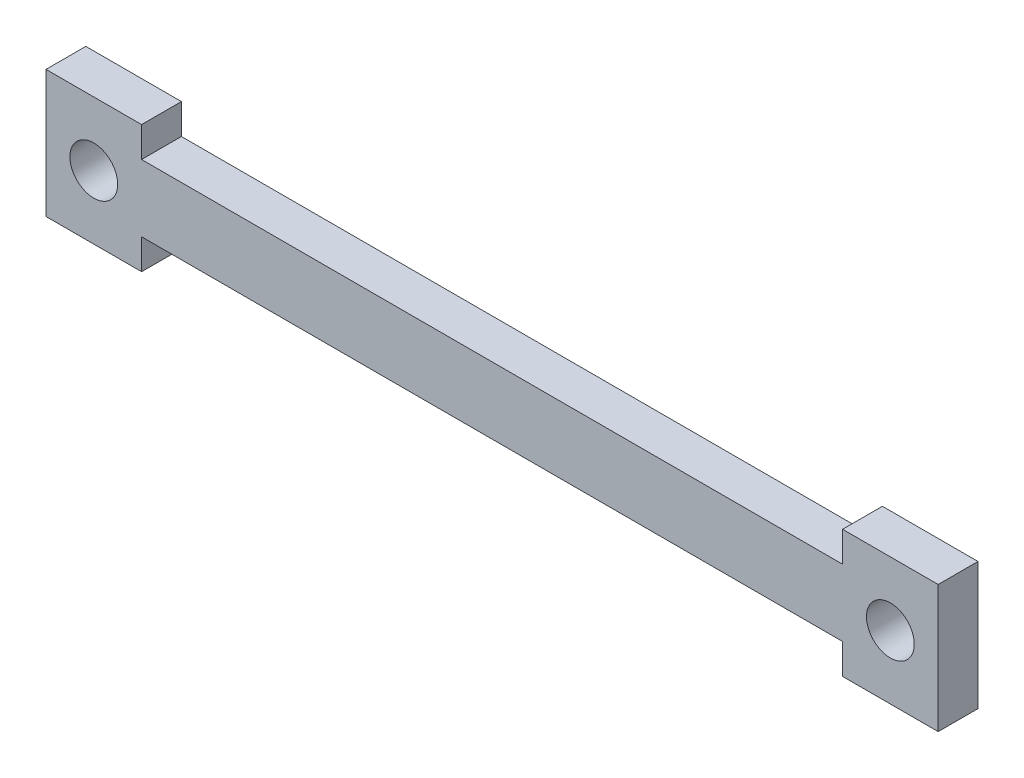
ISO-10303-21;
HEADER;
FILE_DESCRIPTION(('STEP AP214'),'2;1');
FILE_NAME('part.step','',(''),(''),'','','');
FILE_SCHEMA(('AUTOMOTIVE_DESIGN { 1 0 10303 214 1 1 1 1 }'));
ENDSEC;
DATA;
#1=APPLICATION_CONTEXT('core data for automotive mechanical design processes');
#2=APPLICATION_PROTOCOL_DEFINITION('international standard','automotive_design',2000,#1);
#3=PRODUCT_CONTEXT('',#1,'mechanical');
#4=PRODUCT('Part','Part','',(#3));
#5=PRODUCT_RELATED_PRODUCT_CATEGORY('part','',(#4));
#6=PRODUCT_DEFINITION_FORMATION('','',#4);
#7=PRODUCT_DEFINITION_CONTEXT('part definition',#1,'design');
#8=PRODUCT_DEFINITION('design','',#6,#7);
#9=PRODUCT_DEFINITION_SHAPE('','',#8);
#10=(LENGTH_UNIT() NAMED_UNIT(*) SI_UNIT(.MILLI.,.METRE.));
#11=(NAMED_UNIT(*) PLANE_ANGLE_UNIT() SI_UNIT($,.RADIAN.));
#12=(NAMED_UNIT(*) SI_UNIT($,.STERADIAN.) SOLID_ANGLE_UNIT());
#13=UNCERTAINTY_MEASURE_WITH_UNIT(LENGTH_MEASURE(1.E-05),#10,'distance_accuracy_value','');
#14=(GEOMETRIC_REPRESENTATION_CONTEXT(3) GLOBAL_UNCERTAINTY_ASSIGNED_CONTEXT((#13)) GLOBAL_UNIT_ASSIGNED_CONTEXT((#10,
#11,#12)) REPRESENTATION_CONTEXT('',''));
#15=CARTESIAN_POINT('',(0.,0.,0.));
#16=DIRECTION('',(0.,0.,1.));
#17=DIRECTION('',(1.,0.,0.));
#18=AXIS2_PLACEMENT_3D('',#15,#16,#17);
#19=CARTESIAN_POINT('',(22.,-4.,2.5));
#20=DIRECTION('',(0.,1.,0.));
#21=DIRECTION('',(0.,0.,1.));
#22=AXIS2_PLACEMENT_3D('',#19,#20,#21);
#23=PLANE('',#22);
#24=DIRECTION('',(1.,0.,0.));
#25=VECTOR('',#24,1.);
#26=CARTESIAN_POINT('',(22.,-4.,0.));
#27=LINE('',#26,#25);
#28=CARTESIAN_POINT('',(22.,-4.,0.));
#29=VERTEX_POINT('',#28);
#30=CARTESIAN_POINT('',(28.,-4.,0.));
#31=VERTEX_POINT('',#30);
#32=EDGE_CURVE('E157',#29,#31,#27,.T.);
#33=ORIENTED_EDGE('',*,*,#32,.T.);
#34=DIRECTION('',(0.,0.,-1.));
#35=VECTOR('',#34,1.);
#36=CARTESIAN_POINT('',(28.,-4.,2.5));
#37=LINE('',#36,#35);
#38=CARTESIAN_POINT('',(28.,-4.,2.5));
#39=VERTEX_POINT('',#38);
#40=EDGE_CURVE('E11',#39,#31,#37,.T.);
#41=ORIENTED_EDGE('',*,*,#40,.F.);
#42=DIRECTION('',(1.,0.,0.));
#43=VECTOR('',#42,1.);
#44=CARTESIAN_POINT('',(22.,-4.,2.5));
#45=LINE('',#44,#43);
#46=CARTESIAN_POINT('',(22.,-4.,2.5));
#47=VERTEX_POINT('',#46);
#48=EDGE_CURVE('E180',#47,#39,#45,.T.);
#49=ORIENTED_EDGE('',*,*,#48,.F.);
#50=DIRECTION('',(0.,0.,-1.));
#51=VECTOR('',#50,1.);
#52=CARTESIAN_POINT('',(22.,-4.,2.5));
#53=LINE('',#52,#51);
#54=EDGE_CURVE('E153',#47,#29,#53,.T.);
#55=ORIENTED_EDGE('',*,*,#54,.T.);
#56=EDGE_LOOP('',(#33,#41,#49,#55));
#57=FACE_BOUND('',#56,.T.);
#58=ADVANCED_FACE('F37',(#57),#23,.F.);
#59=CARTESIAN_POINT('',(28.,4.,2.5));
#60=DIRECTION('',(-1.,0.,0.));
#61=DIRECTION('',(0.,0.,1.));
#62=AXIS2_PLACEMENT_3D('',#59,#60,#61);
#63=PLANE('',#62);
#64=DIRECTION('',(0.,1.,0.));
#65=VECTOR('',#64,1.);
#66=CARTESIAN_POINT('',(28.,4.,0.));
#67=LINE('',#66,#65);
#68=CARTESIAN_POINT('',(28.,4.,0.));
#69=VERTEX_POINT('',#68);
#70=EDGE_CURVE('E160',#31,#69,#67,.T.);
#71=ORIENTED_EDGE('',*,*,#70,.T.);
#72=DIRECTION('',(0.,0.,-1.));
#73=VECTOR('',#72,1.);
#74=CARTESIAN_POINT('',(28.,4.,2.5));
#75=LINE('',#74,#73);
#76=CARTESIAN_POINT('',(28.,4.,2.5));
#77=VERTEX_POINT('',#76);
#78=EDGE_CURVE('E45',#77,#69,#75,.T.);
#79=ORIENTED_EDGE('',*,*,#78,.F.);
#80=DIRECTION('',(0.,1.,0.));
#81=VECTOR('',#80,1.);
#82=CARTESIAN_POINT('',(28.,4.,2.5));
#83=LINE('',#82,#81);
#84=EDGE_CURVE('E108',#39,#77,#83,.T.);
#85=ORIENTED_EDGE('',*,*,#84,.F.);
#86=ORIENTED_EDGE('',*,*,#40,.T.);
#87=EDGE_LOOP('',(#71,#79,#85,#86));
#88=FACE_BOUND('',#87,.T.);
#89=ADVANCED_FACE('F259',(#88),#63,.F.);
#90=CARTESIAN_POINT('',(22.,4.,2.5));
#91=DIRECTION('',(0.,-1.,0.));
#92=DIRECTION('',(0.,0.,-1.));
#93=AXIS2_PLACEMENT_3D('',#90,#91,#92);
#94=PLANE('',#93);
#95=DIRECTION('',(-1.,0.,0.));
#96=VECTOR('',#95,1.);
#97=CARTESIAN_POINT('',(22.,4.,0.));
#98=LINE('',#97,#96);
#99=CARTESIAN_POINT('',(22.,4.,0.));
#100=VERTEX_POINT('',#99);
#101=EDGE_CURVE('E163',#69,#100,#98,.T.);
#102=ORIENTED_EDGE('',*,*,#101,.T.);
#103=DIRECTION('',(0.,0.,-1.));
#104=VECTOR('',#103,1.);
#105=CARTESIAN_POINT('',(22.,4.,2.5));
#106=LINE('',#105,#104);
#107=CARTESIAN_POINT('',(22.,4.,2.5));
#108=VERTEX_POINT('',#107);
#109=EDGE_CURVE('E199',#108,#100,#106,.T.);
#110=ORIENTED_EDGE('',*,*,#109,.F.);
#111=DIRECTION('',(-1.,0.,0.));
#112=VECTOR('',#111,1.);
#113=CARTESIAN_POINT('',(22.,4.,2.5));
#114=LINE('',#113,#112);
#115=EDGE_CURVE('E207',#77,#108,#114,.T.);
#116=ORIENTED_EDGE('',*,*,#115,.F.);
#117=ORIENTED_EDGE('',*,*,#78,.T.);
#118=EDGE_LOOP('',(#102,#110,#116,#117));
#119=FACE_BOUND('',#118,.T.);
#120=ADVANCED_FACE('F205',(#119),#94,.F.);
#121=CARTESIAN_POINT('',(22.,4.,2.5));
#122=DIRECTION('',(1.,0.,0.));
#123=DIRECTION('',(0.,0.,-1.));
#124=AXIS2_PLACEMENT_3D('',#121,#122,#123);
#125=PLANE('',#124);
#126=DIRECTION('',(0.,-1.,0.));
#127=VECTOR('',#126,1.);
#128=CARTESIAN_POINT('',(22.,4.,0.));
#129=LINE('',#128,#127);
#130=CARTESIAN_POINT('',(22.,2.1,0.));
#131=VERTEX_POINT('',#130);
#132=EDGE_CURVE('E165',#100,#131,#129,.T.);
#133=ORIENTED_EDGE('',*,*,#132,.T.);
#134=DIRECTION('',(0.,0.,-1.));
#135=VECTOR('',#134,1.);
#136=CARTESIAN_POINT('',(22.,2.1,2.5));
#137=LINE('',#136,#135);
#138=CARTESIAN_POINT('',(22.,2.1,2.5));
#139=VERTEX_POINT('',#138);
#140=EDGE_CURVE('E196',#139,#131,#137,.T.);
#141=ORIENTED_EDGE('',*,*,#140,.F.);
#142=DIRECTION('',(0.,-1.,0.));
#143=VECTOR('',#142,1.);
#144=CARTESIAN_POINT('',(22.,4.,2.5));
#145=LINE('',#144,#143);
#146=EDGE_CURVE('E225',#108,#139,#145,.T.);
#147=ORIENTED_EDGE('',*,*,#146,.F.);
#148=ORIENTED_EDGE('',*,*,#109,.T.);
#149=EDGE_LOOP('',(#133,#141,#147,#148));
#150=FACE_BOUND('',#149,.T.);
#151=ADVANCED_FACE('F216',(#150),#125,.F.);
#152=CARTESIAN_POINT('',(-22.,2.1,2.5));
#153=DIRECTION('',(0.,-1.,0.));
#154=DIRECTION('',(0.,0.,-1.));
#155=AXIS2_PLACEMENT_3D('',#152,#153,#154);
#156=PLANE('',#155);
#157=DIRECTION('',(-1.,0.,0.));
#158=VECTOR('',#157,1.);
#159=CARTESIAN_POINT('',(-22.,2.1,0.));
#160=LINE('',#159,#158);
#161=CARTESIAN_POINT('',(-22.,2.1,0.));
#162=VERTEX_POINT('',#161);
#163=EDGE_CURVE('E167',#131,#162,#160,.T.);
#164=ORIENTED_EDGE('',*,*,#163,.T.);
#165=DIRECTION('',(0.,0.,-1.));
#166=VECTOR('',#165,1.);
#167=CARTESIAN_POINT('',(-22.,2.1,2.5));
#168=LINE('',#167,#166);
#169=CARTESIAN_POINT('',(-22.,2.1,2.5));
#170=VERTEX_POINT('',#169);
#171=EDGE_CURVE('E193',#170,#162,#168,.T.);
#172=ORIENTED_EDGE('',*,*,#171,.F.);
#173=DIRECTION('',(-1.,0.,0.));
#174=VECTOR('',#173,1.);
#175=CARTESIAN_POINT('',(-22.,2.1,2.5));
#176=LINE('',#175,#174);
#177=EDGE_CURVE('E222',#139,#170,#176,.T.);
#178=ORIENTED_EDGE('',*,*,#177,.F.);
#179=ORIENTED_EDGE('',*,*,#140,.T.);
#180=EDGE_LOOP('',(#164,#172,#178,#179));
#181=FACE_BOUND('',#180,.T.);
#182=ADVANCED_FACE('F220',(#181),#156,.F.);
#183=CARTESIAN_POINT('',(-22.,4.,2.5));
#184=DIRECTION('',(-1.,0.,0.));
#185=DIRECTION('',(0.,0.,1.));
#186=AXIS2_PLACEMENT_3D('',#183,#184,#185);
#187=PLANE('',#186);
#188=DIRECTION('',(0.,1.,0.));
#189=VECTOR('',#188,1.);
#190=CARTESIAN_POINT('',(-22.,4.,0.));
#191=LINE('',#190,#189);
#192=CARTESIAN_POINT('',(-22.,4.,0.));
#193=VERTEX_POINT('',#192);
#194=EDGE_CURVE('E169',#162,#193,#191,.T.);
#195=ORIENTED_EDGE('',*,*,#194,.T.);
#196=DIRECTION('',(0.,0.,-1.));
#197=VECTOR('',#196,1.);
#198=CARTESIAN_POINT('',(-22.,4.,2.5));
#199=LINE('',#198,#197);
#200=CARTESIAN_POINT('',(-22.,4.,2.5));
#201=VERTEX_POINT('',#200);
#202=EDGE_CURVE('E190',#201,#193,#199,.T.);
#203=ORIENTED_EDGE('',*,*,#202,.F.);
#204=DIRECTION('',(0.,1.,0.));
#205=VECTOR('',#204,1.);
#206=CARTESIAN_POINT('',(-22.,4.,2.5));
#207=LINE('',#206,#205);
#208=EDGE_CURVE('E224',#170,#201,#207,.T.);
#209=ORIENTED_EDGE('',*,*,#208,.F.);
#210=ORIENTED_EDGE('',*,*,#171,.T.);
#211=EDGE_LOOP('',(#195,#203,#209,#210));
#212=FACE_BOUND('',#211,.T.);
#213=ADVANCED_FACE('F272',(#212),#187,.F.);
#214=CARTESIAN_POINT('',(-28.,4.,2.5));
#215=DIRECTION('',(0.,-1.,0.));
#216=DIRECTION('',(0.,0.,-1.));
#217=AXIS2_PLACEMENT_3D('',#214,#215,#216);
#218=PLANE('',#217);
#219=DIRECTION('',(-1.,0.,0.));
#220=VECTOR('',#219,1.);
#221=CARTESIAN_POINT('',(-28.,4.,0.));
#222=LINE('',#221,#220);
#223=CARTESIAN_POINT('',(-28.,4.,0.));
#224=VERTEX_POINT('',#223);
#225=EDGE_CURVE('E171',#193,#224,#222,.T.);
#226=ORIENTED_EDGE('',*,*,#225,.T.);
#227=DIRECTION('',(0.,0.,-1.));
#228=VECTOR('',#227,1.);
#229=CARTESIAN_POINT('',(-28.,4.,2.5));
#230=LINE('',#229,#228);
#231=CARTESIAN_POINT('',(-28.,4.,2.5));
#232=VERTEX_POINT('',#231);
#233=EDGE_CURVE('E187',#232,#224,#230,.T.);
#234=ORIENTED_EDGE('',*,*,#233,.F.);
#235=DIRECTION('',(-1.,0.,0.));
#236=VECTOR('',#235,1.);
#237=CARTESIAN_POINT('',(-28.,4.,2.5));
#238=LINE('',#237,#236);
#239=EDGE_CURVE('E227',#201,#232,#238,.T.);
#240=ORIENTED_EDGE('',*,*,#239,.F.);
#241=ORIENTED_EDGE('',*,*,#202,.T.);
#242=EDGE_LOOP('',(#226,#234,#240,#241));
#243=FACE_BOUND('',#242,.T.);
#244=ADVANCED_FACE('F275',(#243),#218,.F.);
#245=CARTESIAN_POINT('',(-28.,4.,2.5));
#246=DIRECTION('',(1.,0.,0.));
#247=DIRECTION('',(0.,1.,0.));
#248=AXIS2_PLACEMENT_3D('',#245,#246,#247);
#249=PLANE('',#248);
#250=DIRECTION('',(0.,-1.,0.));
#251=VECTOR('',#250,1.);
#252=CARTESIAN_POINT('',(-28.,4.,0.));
#253=LINE('',#252,#251);
#254=CARTESIAN_POINT('',(-28.,-4.,0.));
#255=VERTEX_POINT('',#254);
#256=EDGE_CURVE('E173',#224,#255,#253,.T.);
#257=ORIENTED_EDGE('',*,*,#256,.T.);
#258=DIRECTION('',(0.,0.,-1.));
#259=VECTOR('',#258,1.);
#260=CARTESIAN_POINT('',(-28.,-4.,2.5));
#261=LINE('',#260,#259);
#262=CARTESIAN_POINT('',(-28.,-4.,2.5));
#263=VERTEX_POINT('',#262);
#264=EDGE_CURVE('E184',#263,#255,#261,.T.);
#265=ORIENTED_EDGE('',*,*,#264,.F.);
#266=DIRECTION('',(0.,-1.,0.));
#267=VECTOR('',#266,1.);
#268=CARTESIAN_POINT('',(-28.,4.,2.5));
#269=LINE('',#268,#267);
#270=EDGE_CURVE('E233',#232,#263,#269,.T.);
#271=ORIENTED_EDGE('',*,*,#270,.F.);
#272=ORIENTED_EDGE('',*,*,#233,.T.);
#273=EDGE_LOOP('',(#257,#265,#271,#272));
#274=FACE_BOUND('',#273,.T.);
#275=ADVANCED_FACE('F239',(#274),#249,.F.);
#276=CARTESIAN_POINT('',(-28.,-4.,2.5));
#277=DIRECTION('',(0.,1.,0.));
#278=DIRECTION('',(0.,0.,1.));
#279=AXIS2_PLACEMENT_3D('',#276,#277,#278);
#280=PLANE('',#279);
#281=DIRECTION('',(1.,0.,0.));
#282=VECTOR('',#281,1.);
#283=CARTESIAN_POINT('',(-28.,-4.,0.));
#284=LINE('',#283,#282);
#285=CARTESIAN_POINT('',(-22.,-4.,0.));
#286=VERTEX_POINT('',#285);
#287=EDGE_CURVE('E175',#255,#286,#284,.T.);
#288=ORIENTED_EDGE('',*,*,#287,.T.);
#289=DIRECTION('',(0.,0.,-1.));
#290=VECTOR('',#289,1.);
#291=CARTESIAN_POINT('',(-22.,-4.,2.5));
#292=LINE('',#291,#290);
#293=CARTESIAN_POINT('',(-22.,-4.,2.5));
#294=VERTEX_POINT('',#293);
#295=EDGE_CURVE('E148',#294,#286,#292,.T.);
#296=ORIENTED_EDGE('',*,*,#295,.F.);
#297=DIRECTION('',(1.,0.,0.));
#298=VECTOR('',#297,1.);
#299=CARTESIAN_POINT('',(-28.,-4.,2.5));
#300=LINE('',#299,#298);
#301=EDGE_CURVE('E139',#263,#294,#300,.T.);
#302=ORIENTED_EDGE('',*,*,#301,.F.);
#303=ORIENTED_EDGE('',*,*,#264,.T.);
#304=EDGE_LOOP('',(#288,#296,#302,#303));
#305=FACE_BOUND('',#304,.T.);
#306=ADVANCED_FACE('F243',(#305),#280,.F.);
#307=CARTESIAN_POINT('',(-22.,-2.1,2.5));
#308=DIRECTION('',(-1.,0.,0.));
#309=DIRECTION('',(0.,0.,1.));
#310=AXIS2_PLACEMENT_3D('',#307,#308,#309);
#311=PLANE('',#310);
#312=DIRECTION('',(0.,1.,0.));
#313=VECTOR('',#312,1.);
#314=CARTESIAN_POINT('',(-22.,-2.1,0.));
#315=LINE('',#314,#313);
#316=CARTESIAN_POINT('',(-22.,-2.1,0.));
#317=VERTEX_POINT('',#316);
#318=EDGE_CURVE('E147',#286,#317,#315,.T.);
#319=ORIENTED_EDGE('',*,*,#318,.T.);
#320=DIRECTION('',(0.,0.,-1.));
#321=VECTOR('',#320,1.);
#322=CARTESIAN_POINT('',(-22.,-2.1,2.5));
#323=LINE('',#322,#321);
#324=CARTESIAN_POINT('',(-22.,-2.1,2.5));
#325=VERTEX_POINT('',#324);
#326=EDGE_CURVE('E144',#325,#317,#323,.T.);
#327=ORIENTED_EDGE('',*,*,#326,.F.);
#328=DIRECTION('',(0.,1.,0.));
#329=VECTOR('',#328,1.);
#330=CARTESIAN_POINT('',(-22.,-2.1,2.5));
#331=LINE('',#330,#329);
#332=EDGE_CURVE('E133',#294,#325,#331,.T.);
#333=ORIENTED_EDGE('',*,*,#332,.F.);
#334=ORIENTED_EDGE('',*,*,#295,.T.);
#335=EDGE_LOOP('',(#319,#327,#333,#334));
#336=FACE_BOUND('',#335,.T.);
#337=ADVANCED_FACE('F145',(#336),#311,.F.);
#338=CARTESIAN_POINT('',(-22.,-2.1,2.5));
#339=DIRECTION('',(0.,1.,0.));
#340=DIRECTION('',(0.,0.,1.));
#341=AXIS2_PLACEMENT_3D('',#338,#339,#340);
#342=PLANE('',#341);
#343=DIRECTION('',(1.,0.,0.));
#344=VECTOR('',#343,1.);
#345=CARTESIAN_POINT('',(-22.,-2.1,0.));
#346=LINE('',#345,#344);
#347=CARTESIAN_POINT('',(22.,-2.1,0.));
#348=VERTEX_POINT('',#347);
#349=EDGE_CURVE('E94',#317,#348,#346,.T.);
#350=ORIENTED_EDGE('',*,*,#349,.T.);
#351=DIRECTION('',(0.,0.,-1.));
#352=VECTOR('',#351,1.);
#353=CARTESIAN_POINT('',(22.,-2.1,2.5));
#354=LINE('',#353,#352);
#355=CARTESIAN_POINT('',(22.,-2.1,2.5));
#356=VERTEX_POINT('',#355);
#357=EDGE_CURVE('E149',#356,#348,#354,.T.);
#358=ORIENTED_EDGE('',*,*,#357,.F.);
#359=DIRECTION('',(1.,0.,0.));
#360=VECTOR('',#359,1.);
#361=CARTESIAN_POINT('',(-22.,-2.1,2.5));
#362=LINE('',#361,#360);
#363=EDGE_CURVE('E137',#325,#356,#362,.T.);
#364=ORIENTED_EDGE('',*,*,#363,.F.);
#365=ORIENTED_EDGE('',*,*,#326,.T.);
#366=EDGE_LOOP('',(#350,#358,#364,#365));
#367=FACE_BOUND('',#366,.T.);
#368=ADVANCED_FACE('F151',(#367),#342,.F.);
#369=CARTESIAN_POINT('',(22.,-2.1,2.5));
#370=DIRECTION('',(1.,0.,0.));
#371=DIRECTION('',(0.,1.,0.));
#372=AXIS2_PLACEMENT_3D('',#369,#370,#371);
#373=PLANE('',#372);
#374=DIRECTION('',(0.,-1.,0.));
#375=VECTOR('',#374,1.);
#376=CARTESIAN_POINT('',(22.,-2.1,0.));
#377=LINE('',#376,#375);
#378=EDGE_CURVE('E100',#348,#29,#377,.T.);
#379=ORIENTED_EDGE('',*,*,#378,.T.);
#380=ORIENTED_EDGE('',*,*,#54,.F.);
#381=DIRECTION('',(0.,-1.,0.));
#382=VECTOR('',#381,1.);
#383=CARTESIAN_POINT('',(22.,-2.1,2.5));
#384=LINE('',#383,#382);
#385=EDGE_CURVE('E53',#356,#47,#384,.T.);
#386=ORIENTED_EDGE('',*,*,#385,.F.);
#387=ORIENTED_EDGE('',*,*,#357,.T.);
#388=EDGE_LOOP('',(#379,#380,#386,#387));
#389=FACE_BOUND('',#388,.T.);
#390=ADVANCED_FACE('F247',(#389),#373,.F.);
#391=CARTESIAN_POINT('',(0.,0.,2.5));
#392=DIRECTION('',(0.,0.,-1.));
#393=DIRECTION('',(-1.,0.,0.));
#394=AXIS2_PLACEMENT_3D('',#391,#392,#393);
#395=PLANE('',#394);
#396=CARTESIAN_POINT('',(-25.,0.,2.5));
#397=DIRECTION('',(0.,0.,1.));
#398=DIRECTION('',(1.,0.,0.));
#399=AXIS2_PLACEMENT_3D('',#396,#397,#398);
#400=CIRCLE('',#399,1.5);
#401=CARTESIAN_POINT('',(-23.5,0.,2.5));
#402=VERTEX_POINT('',#401);
#403=EDGE_CURVE('E340',#402,#402,#400,.T.);
#404=ORIENTED_EDGE('',*,*,#403,.F.);
#405=EDGE_LOOP('',(#404));
#406=FACE_BOUND('',#405,.T.);
#407=CARTESIAN_POINT('',(25.,0.,2.5));
#408=DIRECTION('',(0.,0.,1.));
#409=DIRECTION('',(-1.,0.,0.));
#410=AXIS2_PLACEMENT_3D('',#407,#408,#409);
#411=CIRCLE('',#410,1.5);
#412=CARTESIAN_POINT('',(23.5,0.,2.5));
#413=VERTEX_POINT('',#412);
#414=EDGE_CURVE('E345',#413,#413,#411,.T.);
#415=ORIENTED_EDGE('',*,*,#414,.F.);
#416=EDGE_LOOP('',(#415));
#417=FACE_BOUND('',#416,.T.);
#418=ORIENTED_EDGE('',*,*,#48,.T.);
#419=ORIENTED_EDGE('',*,*,#84,.T.);
#420=ORIENTED_EDGE('',*,*,#115,.T.);
#421=ORIENTED_EDGE('',*,*,#146,.T.);
#422=ORIENTED_EDGE('',*,*,#177,.T.);
#423=ORIENTED_EDGE('',*,*,#208,.T.);
#424=ORIENTED_EDGE('',*,*,#239,.T.);
#425=ORIENTED_EDGE('',*,*,#270,.T.);
#426=ORIENTED_EDGE('',*,*,#301,.T.);
#427=ORIENTED_EDGE('',*,*,#332,.T.);
#428=ORIENTED_EDGE('',*,*,#363,.T.);
#429=ORIENTED_EDGE('',*,*,#385,.T.);
#430=EDGE_LOOP('',(#418,#419,#420,#421,#422,#423,#424,#425,#426,#427,#428,#429));
#431=FACE_BOUND('',#430,.T.);
#432=ADVANCED_FACE('F135',(#406,#417,#431),#395,.F.);
#433=CARTESIAN_POINT('',(0.,0.,0.));
#434=DIRECTION('',(0.,0.,-1.));
#435=DIRECTION('',(-1.,0.,0.));
#436=AXIS2_PLACEMENT_3D('',#433,#434,#435);
#437=PLANE('',#436);
#438=CARTESIAN_POINT('',(-25.,0.,0.));
#439=DIRECTION('',(0.,0.,1.));
#440=DIRECTION('',(1.,0.,0.));
#441=AXIS2_PLACEMENT_3D('',#438,#439,#440);
#442=CIRCLE('',#441,1.5);
#443=CARTESIAN_POINT('',(-23.5,0.,0.));
#444=VERTEX_POINT('',#443);
#445=EDGE_CURVE('E161',#444,#444,#442,.T.);
#446=ORIENTED_EDGE('',*,*,#445,.T.);
#447=EDGE_LOOP('',(#446));
#448=FACE_BOUND('',#447,.T.);
#449=CARTESIAN_POINT('',(25.,0.,0.));
#450=DIRECTION('',(0.,0.,1.));
#451=DIRECTION('',(-1.,0.,0.));
#452=AXIS2_PLACEMENT_3D('',#449,#450,#451);
#453=CIRCLE('',#452,1.5);
#454=CARTESIAN_POINT('',(23.5,0.,0.));
#455=VERTEX_POINT('',#454);
#456=EDGE_CURVE('E341',#455,#455,#453,.T.);
#457=ORIENTED_EDGE('',*,*,#456,.T.);
#458=EDGE_LOOP('',(#457));
#459=FACE_BOUND('',#458,.T.);
#460=ORIENTED_EDGE('',*,*,#32,.F.);
#461=ORIENTED_EDGE('',*,*,#378,.F.);
#462=ORIENTED_EDGE('',*,*,#349,.F.);
#463=ORIENTED_EDGE('',*,*,#318,.F.);
#464=ORIENTED_EDGE('',*,*,#287,.F.);
#465=ORIENTED_EDGE('',*,*,#256,.F.);
#466=ORIENTED_EDGE('',*,*,#225,.F.);
#467=ORIENTED_EDGE('',*,*,#194,.F.);
#468=ORIENTED_EDGE('',*,*,#163,.F.);
#469=ORIENTED_EDGE('',*,*,#132,.F.);
#470=ORIENTED_EDGE('',*,*,#101,.F.);
#471=ORIENTED_EDGE('',*,*,#70,.F.);
#472=EDGE_LOOP('',(#460,#461,#462,#463,#464,#465,#466,#467,#468,#469,#470,#471));
#473=FACE_BOUND('',#472,.T.);
#474=ADVANCED_FACE('F211',(#448,#459,#473),#437,.T.);
#475=CARTESIAN_POINT('',(25.,0.,0.));
#476=DIRECTION('',(0.,0.,1.));
#477=DIRECTION('',(1.,0.,0.));
#478=AXIS2_PLACEMENT_3D('',#475,#476,#477);
#479=CYLINDRICAL_SURFACE('',#478,1.5);
#480=ORIENTED_EDGE('',*,*,#456,.F.);
#481=EDGE_LOOP('',(#480));
#482=FACE_BOUND('',#481,.T.);
#483=ORIENTED_EDGE('',*,*,#414,.T.);
#484=EDGE_LOOP('',(#483));
#485=FACE_BOUND('',#484,.T.);
#486=ADVANCED_FACE('F312',(#482,#485),#479,.F.);
#487=CARTESIAN_POINT('',(-25.,0.,0.));
#488=DIRECTION('',(0.,0.,1.));
#489=DIRECTION('',(1.,0.,0.));
#490=AXIS2_PLACEMENT_3D('',#487,#488,#489);
#491=CYLINDRICAL_SURFACE('',#490,1.5);
#492=ORIENTED_EDGE('',*,*,#445,.F.);
#493=EDGE_LOOP('',(#492));
#494=FACE_BOUND('',#493,.T.);
#495=ORIENTED_EDGE('',*,*,#403,.T.);
#496=EDGE_LOOP('',(#495));
#497=FACE_BOUND('',#496,.T.);
#498=ADVANCED_FACE('F321',(#494,#497),#491,.F.);
#499=CLOSED_SHELL('',(#58,#89,#120,#151,#182,#213,#244,#275,#306,#337,#368,#390,#432,#474,#486,#498));
#500=MANIFOLD_SOLID_BREP('B2',#499);
#501=ADVANCED_BREP_SHAPE_REPRESENTATION('',(#18,#500),#14);
#502=SHAPE_DEFINITION_REPRESENTATION(#9,#501);
ENDSEC;
END-ISO-10303-21;
